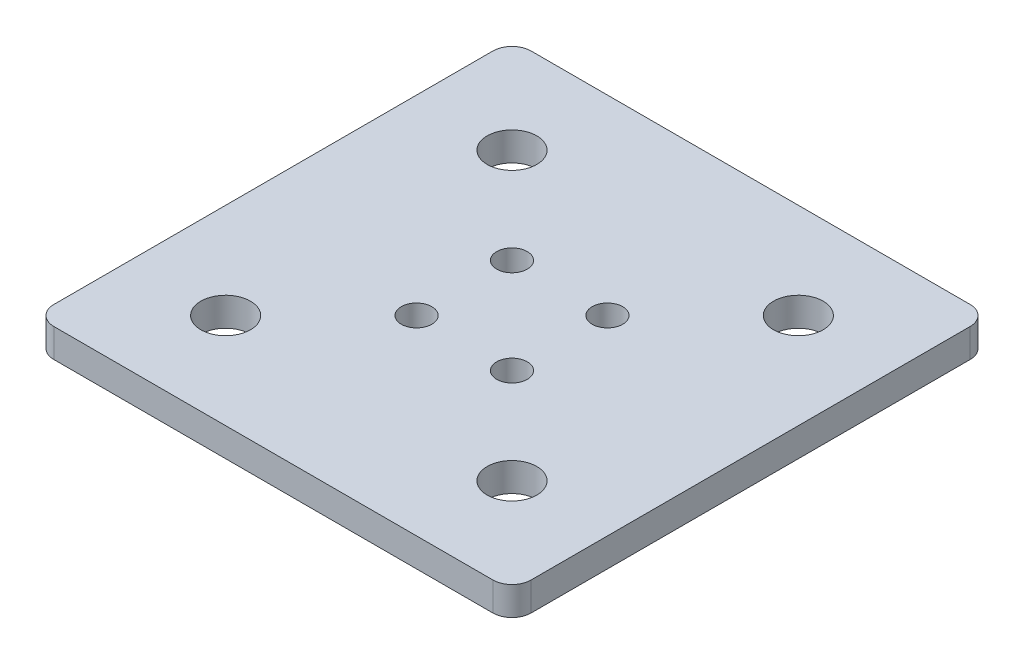
ISO-10303-21;
HEADER;
FILE_DESCRIPTION(('STEP AP214'),'2;1');
FILE_NAME('part.step','',(''),(''),'','','');
FILE_SCHEMA(('AUTOMOTIVE_DESIGN { 1 0 10303 214 1 1 1 1 }'));
ENDSEC;
DATA;
#1=APPLICATION_CONTEXT('core data for automotive mechanical design processes');
#2=APPLICATION_PROTOCOL_DEFINITION('international standard','automotive_design',2000,#1);
#3=PRODUCT_CONTEXT('',#1,'mechanical');
#4=PRODUCT('Part','Part','',(#3));
#5=PRODUCT_RELATED_PRODUCT_CATEGORY('part','',(#4));
#6=PRODUCT_DEFINITION_FORMATION('','',#4);
#7=PRODUCT_DEFINITION_CONTEXT('part definition',#1,'design');
#8=PRODUCT_DEFINITION('design','',#6,#7);
#9=PRODUCT_DEFINITION_SHAPE('','',#8);
#10=(LENGTH_UNIT() NAMED_UNIT(*) SI_UNIT(.MILLI.,.METRE.));
#11=(NAMED_UNIT(*) PLANE_ANGLE_UNIT() SI_UNIT($,.RADIAN.));
#12=(NAMED_UNIT(*) SI_UNIT($,.STERADIAN.) SOLID_ANGLE_UNIT());
#13=UNCERTAINTY_MEASURE_WITH_UNIT(LENGTH_MEASURE(1.E-05),#10,'distance_accuracy_value','');
#14=(GEOMETRIC_REPRESENTATION_CONTEXT(3) GLOBAL_UNCERTAINTY_ASSIGNED_CONTEXT((#13)) GLOBAL_UNIT_ASSIGNED_CONTEXT((#10,
#11,#12)) REPRESENTATION_CONTEXT('',''));
#15=CARTESIAN_POINT('',(0.,0.,0.));
#16=DIRECTION('',(0.,0.,1.));
#17=DIRECTION('',(1.,0.,0.));
#18=AXIS2_PLACEMENT_3D('',#15,#16,#17);
#19=CARTESIAN_POINT('',(0.,3.,0.));
#20=DIRECTION('',(0.,-1.,0.));
#21=DIRECTION('',(0.,0.,-1.));
#22=AXIS2_PLACEMENT_3D('',#19,#20,#21);
#23=PLANE('',#22);
#24=DIRECTION('',(0.,0.,1.));
#25=VECTOR('',#24,1.);
#26=CARTESIAN_POINT('',(-25.,3.,25.));
#27=LINE('',#26,#25);
#28=CARTESIAN_POINT('',(-25.,3.,-23.));
#29=VERTEX_POINT('',#28);
#30=CARTESIAN_POINT('',(-25.,3.,23.));
#31=VERTEX_POINT('',#30);
#32=EDGE_CURVE('E182',#29,#31,#27,.T.);
#33=ORIENTED_EDGE('',*,*,#32,.T.);
#34=CARTESIAN_POINT('',(-23.,3.,23.));
#35=DIRECTION('',(0.,-1.,0.));
#36=DIRECTION('',(0.,0.,-1.));
#37=AXIS2_PLACEMENT_3D('',#34,#35,#36);
#38=CIRCLE('',#37,2.);
#39=CARTESIAN_POINT('',(-23.,3.,25.));
#40=VERTEX_POINT('',#39);
#41=EDGE_CURVE('E159',#31,#40,#38,.F.);
#42=ORIENTED_EDGE('',*,*,#41,.T.);
#43=DIRECTION('',(1.,0.,0.));
#44=VECTOR('',#43,1.);
#45=CARTESIAN_POINT('',(-25.,3.,25.));
#46=LINE('',#45,#44);
#47=CARTESIAN_POINT('',(23.,3.,25.));
#48=VERTEX_POINT('',#47);
#49=EDGE_CURVE('E130',#40,#48,#46,.T.);
#50=ORIENTED_EDGE('',*,*,#49,.T.);
#51=CARTESIAN_POINT('',(23.,3.,23.));
#52=DIRECTION('',(0.,-1.,0.));
#53=DIRECTION('',(0.,0.,-1.));
#54=AXIS2_PLACEMENT_3D('',#51,#52,#53);
#55=CIRCLE('',#54,2.);
#56=CARTESIAN_POINT('',(25.,3.,23.));
#57=VERTEX_POINT('',#56);
#58=EDGE_CURVE('E157',#48,#57,#55,.F.);
#59=ORIENTED_EDGE('',*,*,#58,.T.);
#60=DIRECTION('',(0.,0.,-1.));
#61=VECTOR('',#60,1.);
#62=CARTESIAN_POINT('',(25.,3.,25.));
#63=LINE('',#62,#61);
#64=CARTESIAN_POINT('',(25.,3.,-23.));
#65=VERTEX_POINT('',#64);
#66=EDGE_CURVE('E137',#57,#65,#63,.T.);
#67=ORIENTED_EDGE('',*,*,#66,.T.);
#68=CARTESIAN_POINT('',(23.,3.,-23.));
#69=DIRECTION('',(0.,-1.,0.));
#70=DIRECTION('',(0.,0.,-1.));
#71=AXIS2_PLACEMENT_3D('',#68,#69,#70);
#72=CIRCLE('',#71,2.);
#73=CARTESIAN_POINT('',(23.,3.,-25.));
#74=VERTEX_POINT('',#73);
#75=EDGE_CURVE('E65',#65,#74,#72,.F.);
#76=ORIENTED_EDGE('',*,*,#75,.T.);
#77=DIRECTION('',(-1.,0.,0.));
#78=VECTOR('',#77,1.);
#79=CARTESIAN_POINT('',(-25.,3.,-25.));
#80=LINE('',#79,#78);
#81=CARTESIAN_POINT('',(-23.,3.,-25.));
#82=VERTEX_POINT('',#81);
#83=EDGE_CURVE('E140',#74,#82,#80,.T.);
#84=ORIENTED_EDGE('',*,*,#83,.T.);
#85=CARTESIAN_POINT('',(-23.,3.,-23.));
#86=DIRECTION('',(0.,-1.,0.));
#87=DIRECTION('',(0.,0.,-1.));
#88=AXIS2_PLACEMENT_3D('',#85,#86,#87);
#89=CIRCLE('',#88,2.);
#90=EDGE_CURVE('E154',#82,#29,#89,.F.);
#91=ORIENTED_EDGE('',*,*,#90,.T.);
#92=EDGE_LOOP('',(#33,#42,#50,#59,#67,#76,#84,#91));
#93=FACE_BOUND('',#92,.T.);
#94=CARTESIAN_POINT('',(-15.,3.,-15.));
#95=DIRECTION('',(0.,1.,0.));
#96=DIRECTION('',(0.,0.,1.));
#97=AXIS2_PLACEMENT_3D('',#94,#95,#96);
#98=CIRCLE('',#97,2.6);
#99=CARTESIAN_POINT('',(-15.,3.,-12.4));
#100=VERTEX_POINT('',#99);
#101=EDGE_CURVE('E175',#100,#100,#98,.T.);
#102=ORIENTED_EDGE('',*,*,#101,.F.);
#103=EDGE_LOOP('',(#102));
#104=FACE_BOUND('',#103,.T.);
#105=CARTESIAN_POINT('',(-15.,3.,15.));
#106=DIRECTION('',(0.,1.,0.));
#107=DIRECTION('',(0.,0.,-1.));
#108=AXIS2_PLACEMENT_3D('',#105,#106,#107);
#109=CIRCLE('',#108,2.6);
#110=CARTESIAN_POINT('',(-15.,3.,12.4));
#111=VERTEX_POINT('',#110);
#112=EDGE_CURVE('E187',#111,#111,#109,.T.);
#113=ORIENTED_EDGE('',*,*,#112,.F.);
#114=EDGE_LOOP('',(#113));
#115=FACE_BOUND('',#114,.T.);
#116=CARTESIAN_POINT('',(15.,3.,15.));
#117=DIRECTION('',(0.,1.,0.));
#118=DIRECTION('',(0.,0.,1.));
#119=AXIS2_PLACEMENT_3D('',#116,#117,#118);
#120=CIRCLE('',#119,2.6);
#121=CARTESIAN_POINT('',(15.,3.,17.6));
#122=VERTEX_POINT('',#121);
#123=EDGE_CURVE('E192',#122,#122,#120,.T.);
#124=ORIENTED_EDGE('',*,*,#123,.F.);
#125=EDGE_LOOP('',(#124));
#126=FACE_BOUND('',#125,.T.);
#127=CARTESIAN_POINT('',(15.,3.,-15.));
#128=DIRECTION('',(0.,1.,0.));
#129=DIRECTION('',(0.,0.,-1.));
#130=AXIS2_PLACEMENT_3D('',#127,#128,#129);
#131=CIRCLE('',#130,2.6);
#132=CARTESIAN_POINT('',(15.,3.,-17.6));
#133=VERTEX_POINT('',#132);
#134=EDGE_CURVE('E198',#133,#133,#131,.T.);
#135=ORIENTED_EDGE('',*,*,#134,.F.);
#136=EDGE_LOOP('',(#135));
#137=FACE_BOUND('',#136,.T.);
#138=CARTESIAN_POINT('',(-5.,3.,5.));
#139=DIRECTION('',(0.,1.,0.));
#140=DIRECTION('',(0.,0.,-1.));
#141=AXIS2_PLACEMENT_3D('',#138,#139,#140);
#142=CIRCLE('',#141,1.6);
#143=CARTESIAN_POINT('',(-5.,3.,3.4));
#144=VERTEX_POINT('',#143);
#145=EDGE_CURVE('E204',#144,#144,#142,.T.);
#146=ORIENTED_EDGE('',*,*,#145,.F.);
#147=EDGE_LOOP('',(#146));
#148=FACE_BOUND('',#147,.T.);
#149=CARTESIAN_POINT('',(-5.,3.,-5.));
#150=DIRECTION('',(0.,1.,0.));
#151=DIRECTION('',(0.,0.,1.));
#152=AXIS2_PLACEMENT_3D('',#149,#150,#151);
#153=CIRCLE('',#152,1.6);
#154=CARTESIAN_POINT('',(-5.,3.,-3.4));
#155=VERTEX_POINT('',#154);
#156=EDGE_CURVE('E210',#155,#155,#153,.T.);
#157=ORIENTED_EDGE('',*,*,#156,.F.);
#158=EDGE_LOOP('',(#157));
#159=FACE_BOUND('',#158,.T.);
#160=CARTESIAN_POINT('',(5.00000000000001,3.,5.));
#161=DIRECTION('',(0.,1.,0.));
#162=DIRECTION('',(0.,0.,1.));
#163=AXIS2_PLACEMENT_3D('',#160,#161,#162);
#164=CIRCLE('',#163,1.6);
#165=CARTESIAN_POINT('',(5.00000000000001,3.,6.6));
#166=VERTEX_POINT('',#165);
#167=EDGE_CURVE('E216',#166,#166,#164,.T.);
#168=ORIENTED_EDGE('',*,*,#167,.F.);
#169=EDGE_LOOP('',(#168));
#170=FACE_BOUND('',#169,.T.);
#171=CARTESIAN_POINT('',(5.,3.,-5.));
#172=DIRECTION('',(0.,1.,0.));
#173=DIRECTION('',(0.,0.,-1.));
#174=AXIS2_PLACEMENT_3D('',#171,#172,#173);
#175=CIRCLE('',#174,1.6);
#176=CARTESIAN_POINT('',(5.,3.,-6.6));
#177=VERTEX_POINT('',#176);
#178=EDGE_CURVE('E222',#177,#177,#175,.T.);
#179=ORIENTED_EDGE('',*,*,#178,.F.);
#180=EDGE_LOOP('',(#179));
#181=FACE_BOUND('',#180,.T.);
#182=ADVANCED_FACE('F44',(#93,#104,#115,#126,#137,#148,#159,#170,#181),#23,.F.);
#183=CARTESIAN_POINT('',(0.,0.,0.));
#184=DIRECTION('',(0.,-1.,0.));
#185=DIRECTION('',(0.,0.,-1.));
#186=AXIS2_PLACEMENT_3D('',#183,#184,#185);
#187=PLANE('',#186);
#188=CARTESIAN_POINT('',(5.00000000000001,0.,5.));
#189=DIRECTION('',(0.,1.,0.));
#190=DIRECTION('',(0.,0.,1.));
#191=AXIS2_PLACEMENT_3D('',#188,#189,#190);
#192=CIRCLE('',#191,1.6);
#193=CARTESIAN_POINT('',(5.00000000000001,0.,6.6));
#194=VERTEX_POINT('',#193);
#195=EDGE_CURVE('E219',#194,#194,#192,.T.);
#196=ORIENTED_EDGE('',*,*,#195,.T.);
#197=EDGE_LOOP('',(#196));
#198=FACE_BOUND('',#197,.T.);
#199=CARTESIAN_POINT('',(-5.,0.,5.));
#200=DIRECTION('',(0.,1.,0.));
#201=DIRECTION('',(0.,0.,-1.));
#202=AXIS2_PLACEMENT_3D('',#199,#200,#201);
#203=CIRCLE('',#202,1.6);
#204=CARTESIAN_POINT('',(-5.,0.,3.4));
#205=VERTEX_POINT('',#204);
#206=EDGE_CURVE('E207',#205,#205,#203,.T.);
#207=ORIENTED_EDGE('',*,*,#206,.T.);
#208=EDGE_LOOP('',(#207));
#209=FACE_BOUND('',#208,.T.);
#210=CARTESIAN_POINT('',(15.,0.,15.));
#211=DIRECTION('',(0.,1.,0.));
#212=DIRECTION('',(0.,0.,1.));
#213=AXIS2_PLACEMENT_3D('',#210,#211,#212);
#214=CIRCLE('',#213,2.6);
#215=CARTESIAN_POINT('',(15.,0.,17.6));
#216=VERTEX_POINT('',#215);
#217=EDGE_CURVE('E195',#216,#216,#214,.T.);
#218=ORIENTED_EDGE('',*,*,#217,.T.);
#219=EDGE_LOOP('',(#218));
#220=FACE_BOUND('',#219,.T.);
#221=CARTESIAN_POINT('',(-15.,0.,-15.));
#222=DIRECTION('',(0.,1.,0.));
#223=DIRECTION('',(0.,0.,1.));
#224=AXIS2_PLACEMENT_3D('',#221,#222,#223);
#225=CIRCLE('',#224,2.6);
#226=CARTESIAN_POINT('',(-15.,0.,-12.4));
#227=VERTEX_POINT('',#226);
#228=EDGE_CURVE('E178',#227,#227,#225,.T.);
#229=ORIENTED_EDGE('',*,*,#228,.T.);
#230=EDGE_LOOP('',(#229));
#231=FACE_BOUND('',#230,.T.);
#232=DIRECTION('',(1.,0.,0.));
#233=VECTOR('',#232,1.);
#234=CARTESIAN_POINT('',(-25.,0.,25.));
#235=LINE('',#234,#233);
#236=CARTESIAN_POINT('',(-23.,0.,25.));
#237=VERTEX_POINT('',#236);
#238=CARTESIAN_POINT('',(23.,0.,25.));
#239=VERTEX_POINT('',#238);
#240=EDGE_CURVE('E127',#237,#239,#235,.T.);
#241=ORIENTED_EDGE('',*,*,#240,.F.);
#242=CARTESIAN_POINT('',(-23.,0.,23.));
#243=DIRECTION('',(0.,-1.,0.));
#244=DIRECTION('',(0.,0.,-1.));
#245=AXIS2_PLACEMENT_3D('',#242,#243,#244);
#246=CIRCLE('',#245,2.);
#247=CARTESIAN_POINT('',(-25.,0.,23.));
#248=VERTEX_POINT('',#247);
#249=EDGE_CURVE('E110',#237,#248,#246,.T.);
#250=ORIENTED_EDGE('',*,*,#249,.T.);
#251=DIRECTION('',(0.,0.,1.));
#252=VECTOR('',#251,1.);
#253=CARTESIAN_POINT('',(-25.,0.,25.));
#254=LINE('',#253,#252);
#255=CARTESIAN_POINT('',(-25.,0.,-23.));
#256=VERTEX_POINT('',#255);
#257=EDGE_CURVE('E138',#256,#248,#254,.T.);
#258=ORIENTED_EDGE('',*,*,#257,.F.);
#259=CARTESIAN_POINT('',(-23.,0.,-23.));
#260=DIRECTION('',(0.,-1.,0.));
#261=DIRECTION('',(0.,0.,-1.));
#262=AXIS2_PLACEMENT_3D('',#259,#260,#261);
#263=CIRCLE('',#262,2.);
#264=CARTESIAN_POINT('',(-23.,0.,-25.));
#265=VERTEX_POINT('',#264);
#266=EDGE_CURVE('E131',#256,#265,#263,.T.);
#267=ORIENTED_EDGE('',*,*,#266,.T.);
#268=DIRECTION('',(-1.,0.,0.));
#269=VECTOR('',#268,1.);
#270=CARTESIAN_POINT('',(-25.,0.,-25.));
#271=LINE('',#270,#269);
#272=CARTESIAN_POINT('',(23.,0.,-25.));
#273=VERTEX_POINT('',#272);
#274=EDGE_CURVE('E142',#273,#265,#271,.T.);
#275=ORIENTED_EDGE('',*,*,#274,.F.);
#276=CARTESIAN_POINT('',(23.,0.,-23.));
#277=DIRECTION('',(0.,-1.,0.));
#278=DIRECTION('',(0.,0.,-1.));
#279=AXIS2_PLACEMENT_3D('',#276,#277,#278);
#280=CIRCLE('',#279,2.);
#281=CARTESIAN_POINT('',(25.,0.,-23.));
#282=VERTEX_POINT('',#281);
#283=EDGE_CURVE('E148',#273,#282,#280,.T.);
#284=ORIENTED_EDGE('',*,*,#283,.T.);
#285=DIRECTION('',(0.,0.,-1.));
#286=VECTOR('',#285,1.);
#287=CARTESIAN_POINT('',(25.,0.,25.));
#288=LINE('',#287,#286);
#289=CARTESIAN_POINT('',(25.,0.,23.));
#290=VERTEX_POINT('',#289);
#291=EDGE_CURVE('E170',#290,#282,#288,.T.);
#292=ORIENTED_EDGE('',*,*,#291,.F.);
#293=CARTESIAN_POINT('',(23.,0.,23.));
#294=DIRECTION('',(0.,-1.,0.));
#295=DIRECTION('',(0.,0.,-1.));
#296=AXIS2_PLACEMENT_3D('',#293,#294,#295);
#297=CIRCLE('',#296,2.);
#298=EDGE_CURVE('E121',#290,#239,#297,.T.);
#299=ORIENTED_EDGE('',*,*,#298,.T.);
#300=EDGE_LOOP('',(#241,#250,#258,#267,#275,#284,#292,#299));
#301=FACE_BOUND('',#300,.T.);
#302=CARTESIAN_POINT('',(-15.,0.,15.));
#303=DIRECTION('',(0.,1.,0.));
#304=DIRECTION('',(0.,0.,-1.));
#305=AXIS2_PLACEMENT_3D('',#302,#303,#304);
#306=CIRCLE('',#305,2.6);
#307=CARTESIAN_POINT('',(-15.,0.,12.4));
#308=VERTEX_POINT('',#307);
#309=EDGE_CURVE('E189',#308,#308,#306,.T.);
#310=ORIENTED_EDGE('',*,*,#309,.T.);
#311=EDGE_LOOP('',(#310));
#312=FACE_BOUND('',#311,.T.);
#313=CARTESIAN_POINT('',(15.,0.,-15.));
#314=DIRECTION('',(0.,1.,0.));
#315=DIRECTION('',(0.,0.,-1.));
#316=AXIS2_PLACEMENT_3D('',#313,#314,#315);
#317=CIRCLE('',#316,2.6);
#318=CARTESIAN_POINT('',(15.,0.,-17.6));
#319=VERTEX_POINT('',#318);
#320=EDGE_CURVE('E201',#319,#319,#317,.T.);
#321=ORIENTED_EDGE('',*,*,#320,.T.);
#322=EDGE_LOOP('',(#321));
#323=FACE_BOUND('',#322,.T.);
#324=CARTESIAN_POINT('',(-5.,0.,-5.));
#325=DIRECTION('',(0.,1.,0.));
#326=DIRECTION('',(0.,0.,1.));
#327=AXIS2_PLACEMENT_3D('',#324,#325,#326);
#328=CIRCLE('',#327,1.6);
#329=CARTESIAN_POINT('',(-5.,0.,-3.4));
#330=VERTEX_POINT('',#329);
#331=EDGE_CURVE('E213',#330,#330,#328,.T.);
#332=ORIENTED_EDGE('',*,*,#331,.T.);
#333=EDGE_LOOP('',(#332));
#334=FACE_BOUND('',#333,.T.);
#335=CARTESIAN_POINT('',(5.,0.,-5.));
#336=DIRECTION('',(0.,1.,0.));
#337=DIRECTION('',(0.,0.,-1.));
#338=AXIS2_PLACEMENT_3D('',#335,#336,#337);
#339=CIRCLE('',#338,1.6);
#340=CARTESIAN_POINT('',(5.,0.,-6.6));
#341=VERTEX_POINT('',#340);
#342=EDGE_CURVE('E225',#341,#341,#339,.T.);
#343=ORIENTED_EDGE('',*,*,#342,.T.);
#344=EDGE_LOOP('',(#343));
#345=FACE_BOUND('',#344,.T.);
#346=ADVANCED_FACE('F134',(#198,#209,#220,#231,#301,#312,#323,#334,#345),#187,.T.);
#347=CARTESIAN_POINT('',(25.,3.,25.));
#348=DIRECTION('',(-1.,0.,0.));
#349=DIRECTION('',(0.,0.,1.));
#350=AXIS2_PLACEMENT_3D('',#347,#348,#349);
#351=PLANE('',#350);
#352=ORIENTED_EDGE('',*,*,#66,.F.);
#353=DIRECTION('',(0.,-1.,0.));
#354=VECTOR('',#353,1.);
#355=CARTESIAN_POINT('',(25.,3.,23.));
#356=LINE('',#355,#354);
#357=EDGE_CURVE('E163',#57,#290,#356,.T.);
#358=ORIENTED_EDGE('',*,*,#357,.T.);
#359=ORIENTED_EDGE('',*,*,#291,.T.);
#360=DIRECTION('',(0.,-1.,0.));
#361=VECTOR('',#360,1.);
#362=CARTESIAN_POINT('',(25.,3.,-23.));
#363=LINE('',#362,#361);
#364=EDGE_CURVE('E161',#282,#65,#363,.F.);
#365=ORIENTED_EDGE('',*,*,#364,.T.);
#366=EDGE_LOOP('',(#352,#358,#359,#365));
#367=FACE_BOUND('',#366,.T.);
#368=ADVANCED_FACE('F169',(#367),#351,.F.);
#369=CARTESIAN_POINT('',(-25.,3.,-25.));
#370=DIRECTION('',(0.,0.,1.));
#371=DIRECTION('',(1.,0.,0.));
#372=AXIS2_PLACEMENT_3D('',#369,#370,#371);
#373=PLANE('',#372);
#374=ORIENTED_EDGE('',*,*,#83,.F.);
#375=DIRECTION('',(0.,-1.,0.));
#376=VECTOR('',#375,1.);
#377=CARTESIAN_POINT('',(23.,3.,-25.));
#378=LINE('',#377,#376);
#379=EDGE_CURVE('E11',#74,#273,#378,.T.);
#380=ORIENTED_EDGE('',*,*,#379,.T.);
#381=ORIENTED_EDGE('',*,*,#274,.T.);
#382=DIRECTION('',(0.,-1.,0.));
#383=VECTOR('',#382,1.);
#384=CARTESIAN_POINT('',(-23.,3.,-25.));
#385=LINE('',#384,#383);
#386=EDGE_CURVE('E52',#265,#82,#385,.F.);
#387=ORIENTED_EDGE('',*,*,#386,.T.);
#388=EDGE_LOOP('',(#374,#380,#381,#387));
#389=FACE_BOUND('',#388,.T.);
#390=ADVANCED_FACE('F251',(#389),#373,.F.);
#391=CARTESIAN_POINT('',(-25.,3.,25.));
#392=DIRECTION('',(1.,0.,0.));
#393=DIRECTION('',(0.,0.,-1.));
#394=AXIS2_PLACEMENT_3D('',#391,#392,#393);
#395=PLANE('',#394);
#396=ORIENTED_EDGE('',*,*,#257,.T.);
#397=DIRECTION('',(0.,-1.,0.));
#398=VECTOR('',#397,1.);
#399=CARTESIAN_POINT('',(-25.,3.,23.));
#400=LINE('',#399,#398);
#401=EDGE_CURVE('E115',#248,#31,#400,.F.);
#402=ORIENTED_EDGE('',*,*,#401,.T.);
#403=ORIENTED_EDGE('',*,*,#32,.F.);
#404=DIRECTION('',(0.,-1.,0.));
#405=VECTOR('',#404,1.);
#406=CARTESIAN_POINT('',(-25.,3.,-23.));
#407=LINE('',#406,#405);
#408=EDGE_CURVE('E120',#29,#256,#407,.T.);
#409=ORIENTED_EDGE('',*,*,#408,.T.);
#410=EDGE_LOOP('',(#396,#402,#403,#409));
#411=FACE_BOUND('',#410,.T.);
#412=ADVANCED_FACE('F248',(#411),#395,.F.);
#413=CARTESIAN_POINT('',(-25.,3.,25.));
#414=DIRECTION('',(0.,0.,-1.));
#415=DIRECTION('',(-1.,0.,0.));
#416=AXIS2_PLACEMENT_3D('',#413,#414,#415);
#417=PLANE('',#416);
#418=ORIENTED_EDGE('',*,*,#49,.F.);
#419=DIRECTION('',(0.,-1.,0.));
#420=VECTOR('',#419,1.);
#421=CARTESIAN_POINT('',(-23.,3.,25.));
#422=LINE('',#421,#420);
#423=EDGE_CURVE('E114',#40,#237,#422,.T.);
#424=ORIENTED_EDGE('',*,*,#423,.T.);
#425=ORIENTED_EDGE('',*,*,#240,.T.);
#426=DIRECTION('',(0.,-1.,0.));
#427=VECTOR('',#426,1.);
#428=CARTESIAN_POINT('',(23.,3.,25.));
#429=LINE('',#428,#427);
#430=EDGE_CURVE('E132',#239,#48,#429,.F.);
#431=ORIENTED_EDGE('',*,*,#430,.T.);
#432=EDGE_LOOP('',(#418,#424,#425,#431));
#433=FACE_BOUND('',#432,.T.);
#434=ADVANCED_FACE('F126',(#433),#417,.F.);
#435=CARTESIAN_POINT('',(-15.,3.,-15.));
#436=DIRECTION('',(0.,-1.,0.));
#437=DIRECTION('',(0.,0.,-1.));
#438=AXIS2_PLACEMENT_3D('',#435,#436,#437);
#439=CYLINDRICAL_SURFACE('',#438,2.6);
#440=ORIENTED_EDGE('',*,*,#101,.T.);
#441=EDGE_LOOP('',(#440));
#442=FACE_BOUND('',#441,.T.);
#443=ORIENTED_EDGE('',*,*,#228,.F.);
#444=EDGE_LOOP('',(#443));
#445=FACE_BOUND('',#444,.T.);
#446=ADVANCED_FACE('F243',(#442,#445),#439,.F.);
#447=CARTESIAN_POINT('',(-15.,3.,15.));
#448=DIRECTION('',(0.,-1.,0.));
#449=DIRECTION('',(0.,0.,-1.));
#450=AXIS2_PLACEMENT_3D('',#447,#448,#449);
#451=CYLINDRICAL_SURFACE('',#450,2.6);
#452=ORIENTED_EDGE('',*,*,#112,.T.);
#453=EDGE_LOOP('',(#452));
#454=FACE_BOUND('',#453,.T.);
#455=ORIENTED_EDGE('',*,*,#309,.F.);
#456=EDGE_LOOP('',(#455));
#457=FACE_BOUND('',#456,.T.);
#458=ADVANCED_FACE('F399',(#454,#457),#451,.F.);
#459=CARTESIAN_POINT('',(15.,3.,15.));
#460=DIRECTION('',(0.,-1.,0.));
#461=DIRECTION('',(0.,0.,-1.));
#462=AXIS2_PLACEMENT_3D('',#459,#460,#461);
#463=CYLINDRICAL_SURFACE('',#462,2.6);
#464=ORIENTED_EDGE('',*,*,#123,.T.);
#465=EDGE_LOOP('',(#464));
#466=FACE_BOUND('',#465,.T.);
#467=ORIENTED_EDGE('',*,*,#217,.F.);
#468=EDGE_LOOP('',(#467));
#469=FACE_BOUND('',#468,.T.);
#470=ADVANCED_FACE('F388',(#466,#469),#463,.F.);
#471=CARTESIAN_POINT('',(15.,3.,-15.));
#472=DIRECTION('',(0.,-1.,0.));
#473=DIRECTION('',(0.,0.,-1.));
#474=AXIS2_PLACEMENT_3D('',#471,#472,#473);
#475=CYLINDRICAL_SURFACE('',#474,2.6);
#476=ORIENTED_EDGE('',*,*,#134,.T.);
#477=EDGE_LOOP('',(#476));
#478=FACE_BOUND('',#477,.T.);
#479=ORIENTED_EDGE('',*,*,#320,.F.);
#480=EDGE_LOOP('',(#479));
#481=FACE_BOUND('',#480,.T.);
#482=ADVANCED_FACE('F377',(#478,#481),#475,.F.);
#483=CARTESIAN_POINT('',(-5.,3.,5.));
#484=DIRECTION('',(0.,-1.,0.));
#485=DIRECTION('',(0.,0.,-1.));
#486=AXIS2_PLACEMENT_3D('',#483,#484,#485);
#487=CYLINDRICAL_SURFACE('',#486,1.6);
#488=ORIENTED_EDGE('',*,*,#145,.T.);
#489=EDGE_LOOP('',(#488));
#490=FACE_BOUND('',#489,.T.);
#491=ORIENTED_EDGE('',*,*,#206,.F.);
#492=EDGE_LOOP('',(#491));
#493=FACE_BOUND('',#492,.T.);
#494=ADVANCED_FACE('F366',(#490,#493),#487,.F.);
#495=CARTESIAN_POINT('',(-5.,3.,-5.));
#496=DIRECTION('',(0.,-1.,0.));
#497=DIRECTION('',(0.,0.,-1.));
#498=AXIS2_PLACEMENT_3D('',#495,#496,#497);
#499=CYLINDRICAL_SURFACE('',#498,1.6);
#500=ORIENTED_EDGE('',*,*,#156,.T.);
#501=EDGE_LOOP('',(#500));
#502=FACE_BOUND('',#501,.T.);
#503=ORIENTED_EDGE('',*,*,#331,.F.);
#504=EDGE_LOOP('',(#503));
#505=FACE_BOUND('',#504,.T.);
#506=ADVANCED_FACE('F355',(#502,#505),#499,.F.);
#507=CARTESIAN_POINT('',(5.00000000000001,3.,5.));
#508=DIRECTION('',(0.,-1.,0.));
#509=DIRECTION('',(0.,0.,-1.));
#510=AXIS2_PLACEMENT_3D('',#507,#508,#509);
#511=CYLINDRICAL_SURFACE('',#510,1.6);
#512=ORIENTED_EDGE('',*,*,#167,.T.);
#513=EDGE_LOOP('',(#512));
#514=FACE_BOUND('',#513,.T.);
#515=ORIENTED_EDGE('',*,*,#195,.F.);
#516=EDGE_LOOP('',(#515));
#517=FACE_BOUND('',#516,.T.);
#518=ADVANCED_FACE('F345',(#514,#517),#511,.F.);
#519=CARTESIAN_POINT('',(5.,3.,-5.));
#520=DIRECTION('',(0.,-1.,0.));
#521=DIRECTION('',(0.,0.,-1.));
#522=AXIS2_PLACEMENT_3D('',#519,#520,#521);
#523=CYLINDRICAL_SURFACE('',#522,1.6);
#524=ORIENTED_EDGE('',*,*,#178,.T.);
#525=EDGE_LOOP('',(#524));
#526=FACE_BOUND('',#525,.T.);
#527=ORIENTED_EDGE('',*,*,#342,.F.);
#528=EDGE_LOOP('',(#527));
#529=FACE_BOUND('',#528,.T.);
#530=ADVANCED_FACE('F231',(#526,#529),#523,.F.);
#531=CARTESIAN_POINT('',(-23.,3.,23.));
#532=DIRECTION('',(0.,-1.,0.));
#533=DIRECTION('',(0.,0.,-1.));
#534=AXIS2_PLACEMENT_3D('',#531,#532,#533);
#535=CYLINDRICAL_SURFACE('',#534,2.);
#536=ORIENTED_EDGE('',*,*,#41,.F.);
#537=ORIENTED_EDGE('',*,*,#401,.F.);
#538=ORIENTED_EDGE('',*,*,#249,.F.);
#539=ORIENTED_EDGE('',*,*,#423,.F.);
#540=EDGE_LOOP('',(#536,#537,#538,#539));
#541=FACE_BOUND('',#540,.T.);
#542=ADVANCED_FACE('F113',(#541),#535,.T.);
#543=CARTESIAN_POINT('',(23.,3.,23.));
#544=DIRECTION('',(0.,-1.,0.));
#545=DIRECTION('',(0.,0.,-1.));
#546=AXIS2_PLACEMENT_3D('',#543,#544,#545);
#547=CYLINDRICAL_SURFACE('',#546,2.);
#548=ORIENTED_EDGE('',*,*,#58,.F.);
#549=ORIENTED_EDGE('',*,*,#430,.F.);
#550=ORIENTED_EDGE('',*,*,#298,.F.);
#551=ORIENTED_EDGE('',*,*,#357,.F.);
#552=EDGE_LOOP('',(#548,#549,#550,#551));
#553=FACE_BOUND('',#552,.T.);
#554=ADVANCED_FACE('F259',(#553),#547,.T.);
#555=CARTESIAN_POINT('',(23.,3.,-23.));
#556=DIRECTION('',(0.,-1.,0.));
#557=DIRECTION('',(0.,0.,-1.));
#558=AXIS2_PLACEMENT_3D('',#555,#556,#557);
#559=CYLINDRICAL_SURFACE('',#558,2.);
#560=ORIENTED_EDGE('',*,*,#75,.F.);
#561=ORIENTED_EDGE('',*,*,#364,.F.);
#562=ORIENTED_EDGE('',*,*,#283,.F.);
#563=ORIENTED_EDGE('',*,*,#379,.F.);
#564=EDGE_LOOP('',(#560,#561,#562,#563));
#565=FACE_BOUND('',#564,.T.);
#566=ADVANCED_FACE('F261',(#565),#559,.T.);
#567=CARTESIAN_POINT('',(-23.,3.,-23.));
#568=DIRECTION('',(0.,-1.,0.));
#569=DIRECTION('',(0.,0.,-1.));
#570=AXIS2_PLACEMENT_3D('',#567,#568,#569);
#571=CYLINDRICAL_SURFACE('',#570,2.);
#572=ORIENTED_EDGE('',*,*,#90,.F.);
#573=ORIENTED_EDGE('',*,*,#386,.F.);
#574=ORIENTED_EDGE('',*,*,#266,.F.);
#575=ORIENTED_EDGE('',*,*,#408,.F.);
#576=EDGE_LOOP('',(#572,#573,#574,#575));
#577=FACE_BOUND('',#576,.T.);
#578=ADVANCED_FACE('F46',(#577),#571,.T.);
#579=CLOSED_SHELL('',(#182,#346,#368,#390,#412,#434,#446,#458,#470,#482,#494,#506,#518,#530,
#542,#554,#566,#578));
#580=MANIFOLD_SOLID_BREP('B2',#579);
#581=ADVANCED_BREP_SHAPE_REPRESENTATION('',(#18,#580),#14);
#582=SHAPE_DEFINITION_REPRESENTATION(#9,#581);
ENDSEC;
END-ISO-10303-21;
